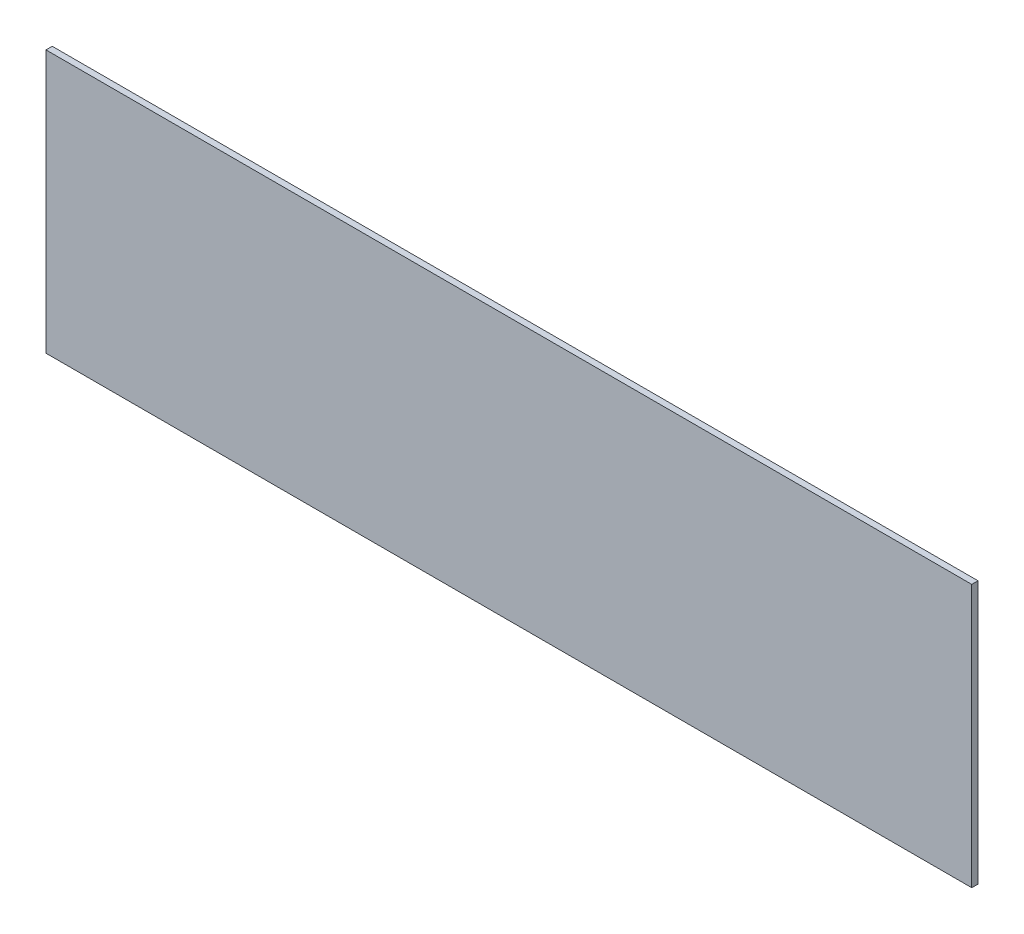
ISO-10303-21;
HEADER;
FILE_DESCRIPTION(('STEP AP214'),'2;1');
FILE_NAME('part.step','',(''),(''),'','','');
FILE_SCHEMA(('AUTOMOTIVE_DESIGN { 1 0 10303 214 1 1 1 1 }'));
ENDSEC;
DATA;
#1=APPLICATION_CONTEXT('core data for automotive mechanical design processes');
#2=APPLICATION_PROTOCOL_DEFINITION('international standard','automotive_design',2000,#1);
#3=PRODUCT_CONTEXT('',#1,'mechanical');
#4=PRODUCT('Part','Part','',(#3));
#5=PRODUCT_RELATED_PRODUCT_CATEGORY('part','',(#4));
#6=PRODUCT_DEFINITION_FORMATION('','',#4);
#7=PRODUCT_DEFINITION_CONTEXT('part definition',#1,'design');
#8=PRODUCT_DEFINITION('design','',#6,#7);
#9=PRODUCT_DEFINITION_SHAPE('','',#8);
#10=(LENGTH_UNIT() NAMED_UNIT(*) SI_UNIT(.MILLI.,.METRE.));
#11=(NAMED_UNIT(*) PLANE_ANGLE_UNIT() SI_UNIT($,.RADIAN.));
#12=(NAMED_UNIT(*) SI_UNIT($,.STERADIAN.) SOLID_ANGLE_UNIT());
#13=UNCERTAINTY_MEASURE_WITH_UNIT(LENGTH_MEASURE(1.E-05),#10,'distance_accuracy_value','');
#14=(GEOMETRIC_REPRESENTATION_CONTEXT(3) GLOBAL_UNCERTAINTY_ASSIGNED_CONTEXT((#13)) GLOBAL_UNIT_ASSIGNED_CONTEXT((#10,
#11,#12)) REPRESENTATION_CONTEXT('',''));
#15=CARTESIAN_POINT('',(0.,0.,0.));
#16=DIRECTION('',(0.,0.,1.));
#17=DIRECTION('',(1.,0.,0.));
#18=AXIS2_PLACEMENT_3D('',#15,#16,#17);
#19=CARTESIAN_POINT('',(234.95,-66.675,3.175));
#20=DIRECTION('',(-1.,0.,0.));
#21=DIRECTION('',(0.,0.,1.));
#22=AXIS2_PLACEMENT_3D('',#19,#20,#21);
#23=PLANE('',#22);
#24=DIRECTION('',(0.,1.,0.));
#25=VECTOR('',#24,1.);
#26=CARTESIAN_POINT('',(234.95,-66.675,0.));
#27=LINE('',#26,#25);
#28=CARTESIAN_POINT('',(234.95,-66.675,0.));
#29=VERTEX_POINT('',#28);
#30=CARTESIAN_POINT('',(234.95,66.675,0.));
#31=VERTEX_POINT('',#30);
#32=EDGE_CURVE('E107',#29,#31,#27,.T.);
#33=ORIENTED_EDGE('',*,*,#32,.T.);
#34=DIRECTION('',(0.,0.,-1.));
#35=VECTOR('',#34,1.);
#36=CARTESIAN_POINT('',(234.95,66.675,3.175));
#37=LINE('',#36,#35);
#38=CARTESIAN_POINT('',(234.95,66.675,3.175));
#39=VERTEX_POINT('',#38);
#40=EDGE_CURVE('E11',#39,#31,#37,.T.);
#41=ORIENTED_EDGE('',*,*,#40,.F.);
#42=DIRECTION('',(0.,1.,0.));
#43=VECTOR('',#42,1.);
#44=CARTESIAN_POINT('',(234.95,-66.675,3.175));
#45=LINE('',#44,#43);
#46=CARTESIAN_POINT('',(234.95,-66.675,3.175));
#47=VERTEX_POINT('',#46);
#48=EDGE_CURVE('E91',#47,#39,#45,.T.);
#49=ORIENTED_EDGE('',*,*,#48,.F.);
#50=DIRECTION('',(0.,0.,-1.));
#51=VECTOR('',#50,1.);
#52=CARTESIAN_POINT('',(234.95,-66.675,3.175));
#53=LINE('',#52,#51);
#54=EDGE_CURVE('E103',#47,#29,#53,.T.);
#55=ORIENTED_EDGE('',*,*,#54,.T.);
#56=EDGE_LOOP('',(#33,#41,#49,#55));
#57=FACE_BOUND('',#56,.T.);
#58=ADVANCED_FACE('F39',(#57),#23,.F.);
#59=CARTESIAN_POINT('',(-234.95,66.675,3.175));
#60=DIRECTION('',(0.,-1.,0.));
#61=DIRECTION('',(0.,0.,-1.));
#62=AXIS2_PLACEMENT_3D('',#59,#60,#61);
#63=PLANE('',#62);
#64=DIRECTION('',(-1.,0.,0.));
#65=VECTOR('',#64,1.);
#66=CARTESIAN_POINT('',(-234.95,66.675,0.));
#67=LINE('',#66,#65);
#68=CARTESIAN_POINT('',(-234.95,66.675,0.));
#69=VERTEX_POINT('',#68);
#70=EDGE_CURVE('E96',#31,#69,#67,.T.);
#71=ORIENTED_EDGE('',*,*,#70,.T.);
#72=DIRECTION('',(0.,0.,-1.));
#73=VECTOR('',#72,1.);
#74=CARTESIAN_POINT('',(-234.95,66.675,3.175));
#75=LINE('',#74,#73);
#76=CARTESIAN_POINT('',(-234.95,66.675,3.175));
#77=VERTEX_POINT('',#76);
#78=EDGE_CURVE('E48',#77,#69,#75,.T.);
#79=ORIENTED_EDGE('',*,*,#78,.F.);
#80=DIRECTION('',(-1.,0.,0.));
#81=VECTOR('',#80,1.);
#82=CARTESIAN_POINT('',(-234.95,66.675,3.175));
#83=LINE('',#82,#81);
#84=EDGE_CURVE('E86',#39,#77,#83,.T.);
#85=ORIENTED_EDGE('',*,*,#84,.F.);
#86=ORIENTED_EDGE('',*,*,#40,.T.);
#87=EDGE_LOOP('',(#71,#79,#85,#86));
#88=FACE_BOUND('',#87,.T.);
#89=ADVANCED_FACE('F95',(#88),#63,.F.);
#90=CARTESIAN_POINT('',(-234.95,-66.675,3.175));
#91=DIRECTION('',(1.,0.,0.));
#92=DIRECTION('',(0.,0.,-1.));
#93=AXIS2_PLACEMENT_3D('',#90,#91,#92);
#94=PLANE('',#93);
#95=DIRECTION('',(0.,-1.,0.));
#96=VECTOR('',#95,1.);
#97=CARTESIAN_POINT('',(-234.95,-66.675,0.));
#98=LINE('',#97,#96);
#99=CARTESIAN_POINT('',(-234.95,-66.675,0.));
#100=VERTEX_POINT('',#99);
#101=EDGE_CURVE('E73',#69,#100,#98,.T.);
#102=ORIENTED_EDGE('',*,*,#101,.T.);
#103=DIRECTION('',(0.,0.,-1.));
#104=VECTOR('',#103,1.);
#105=CARTESIAN_POINT('',(-234.95,-66.675,3.175));
#106=LINE('',#105,#104);
#107=CARTESIAN_POINT('',(-234.95,-66.675,3.175));
#108=VERTEX_POINT('',#107);
#109=EDGE_CURVE('E98',#108,#100,#106,.T.);
#110=ORIENTED_EDGE('',*,*,#109,.F.);
#111=DIRECTION('',(0.,-1.,0.));
#112=VECTOR('',#111,1.);
#113=CARTESIAN_POINT('',(-234.95,-66.675,3.175));
#114=LINE('',#113,#112);
#115=EDGE_CURVE('E89',#77,#108,#114,.T.);
#116=ORIENTED_EDGE('',*,*,#115,.F.);
#117=ORIENTED_EDGE('',*,*,#78,.T.);
#118=EDGE_LOOP('',(#102,#110,#116,#117));
#119=FACE_BOUND('',#118,.T.);
#120=ADVANCED_FACE('F99',(#119),#94,.F.);
#121=CARTESIAN_POINT('',(-234.95,-66.675,3.175));
#122=DIRECTION('',(0.,1.,0.));
#123=DIRECTION('',(0.,0.,1.));
#124=AXIS2_PLACEMENT_3D('',#121,#122,#123);
#125=PLANE('',#124);
#126=DIRECTION('',(1.,0.,0.));
#127=VECTOR('',#126,1.);
#128=CARTESIAN_POINT('',(-234.95,-66.675,0.));
#129=LINE('',#128,#127);
#130=EDGE_CURVE('E79',#100,#29,#129,.T.);
#131=ORIENTED_EDGE('',*,*,#130,.T.);
#132=ORIENTED_EDGE('',*,*,#54,.F.);
#133=DIRECTION('',(1.,0.,0.));
#134=VECTOR('',#133,1.);
#135=CARTESIAN_POINT('',(-234.95,-66.675,3.175));
#136=LINE('',#135,#134);
#137=EDGE_CURVE('E56',#108,#47,#136,.T.);
#138=ORIENTED_EDGE('',*,*,#137,.F.);
#139=ORIENTED_EDGE('',*,*,#109,.T.);
#140=EDGE_LOOP('',(#131,#132,#138,#139));
#141=FACE_BOUND('',#140,.T.);
#142=ADVANCED_FACE('F120',(#141),#125,.F.);
#143=CARTESIAN_POINT('',(0.,0.,3.175));
#144=DIRECTION('',(0.,0.,-1.));
#145=DIRECTION('',(-1.,0.,0.));
#146=AXIS2_PLACEMENT_3D('',#143,#144,#145);
#147=PLANE('',#146);
#148=ORIENTED_EDGE('',*,*,#48,.T.);
#149=ORIENTED_EDGE('',*,*,#84,.T.);
#150=ORIENTED_EDGE('',*,*,#115,.T.);
#151=ORIENTED_EDGE('',*,*,#137,.T.);
#152=EDGE_LOOP('',(#148,#149,#150,#151));
#153=FACE_BOUND('',#152,.T.);
#154=ADVANCED_FACE('F87',(#153),#147,.F.);
#155=CARTESIAN_POINT('',(0.,0.,0.));
#156=DIRECTION('',(0.,0.,-1.));
#157=DIRECTION('',(-1.,0.,0.));
#158=AXIS2_PLACEMENT_3D('',#155,#156,#157);
#159=PLANE('',#158);
#160=ORIENTED_EDGE('',*,*,#32,.F.);
#161=ORIENTED_EDGE('',*,*,#130,.F.);
#162=ORIENTED_EDGE('',*,*,#101,.F.);
#163=ORIENTED_EDGE('',*,*,#70,.F.);
#164=EDGE_LOOP('',(#160,#161,#162,#163));
#165=FACE_BOUND('',#164,.T.);
#166=ADVANCED_FACE('F123',(#165),#159,.T.);
#167=CLOSED_SHELL('',(#58,#89,#120,#142,#154,#166));
#168=MANIFOLD_SOLID_BREP('B2',#167);
#169=ADVANCED_BREP_SHAPE_REPRESENTATION('',(#18,#168),#14);
#170=SHAPE_DEFINITION_REPRESENTATION(#9,#169);
ENDSEC;
END-ISO-10303-21;
